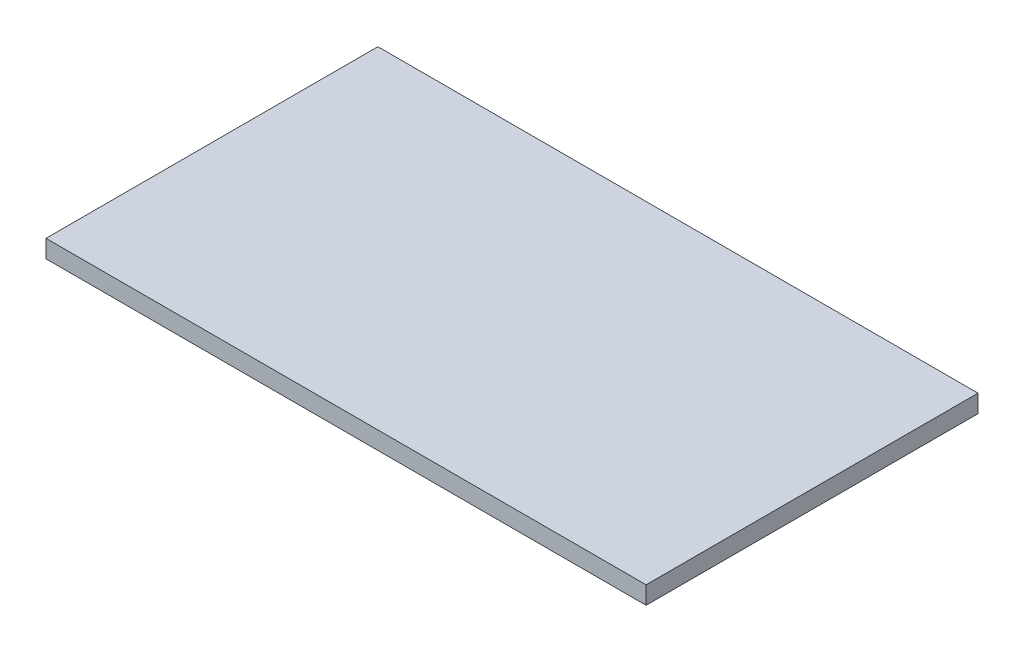
ISO-10303-21;
HEADER;
FILE_DESCRIPTION(('STEP AP214'),'2;1');
FILE_NAME('part.step','',(''),(''),'','','');
FILE_SCHEMA(('AUTOMOTIVE_DESIGN { 1 0 10303 214 1 1 1 1 }'));
ENDSEC;
DATA;
#1=APPLICATION_CONTEXT('core data for automotive mechanical design processes');
#2=APPLICATION_PROTOCOL_DEFINITION('international standard','automotive_design',2000,#1);
#3=PRODUCT_CONTEXT('',#1,'mechanical');
#4=PRODUCT('Part','Part','',(#3));
#5=PRODUCT_RELATED_PRODUCT_CATEGORY('part','',(#4));
#6=PRODUCT_DEFINITION_FORMATION('','',#4);
#7=PRODUCT_DEFINITION_CONTEXT('part definition',#1,'design');
#8=PRODUCT_DEFINITION('design','',#6,#7);
#9=PRODUCT_DEFINITION_SHAPE('','',#8);
#10=(LENGTH_UNIT() NAMED_UNIT(*) SI_UNIT(.MILLI.,.METRE.));
#11=(NAMED_UNIT(*) PLANE_ANGLE_UNIT() SI_UNIT($,.RADIAN.));
#12=(NAMED_UNIT(*) SI_UNIT($,.STERADIAN.) SOLID_ANGLE_UNIT());
#13=UNCERTAINTY_MEASURE_WITH_UNIT(LENGTH_MEASURE(1.E-05),#10,'distance_accuracy_value','');
#14=(GEOMETRIC_REPRESENTATION_CONTEXT(3) GLOBAL_UNCERTAINTY_ASSIGNED_CONTEXT((#13)) GLOBAL_UNIT_ASSIGNED_CONTEXT((#10,
#11,#12)) REPRESENTATION_CONTEXT('',''));
#15=CARTESIAN_POINT('',(0.,0.,0.));
#16=DIRECTION('',(0.,0.,1.));
#17=DIRECTION('',(1.,0.,0.));
#18=AXIS2_PLACEMENT_3D('',#15,#16,#17);
#19=CARTESIAN_POINT('',(-321.46875,19.05,-177.8));
#20=DIRECTION('',(1.,0.,0.));
#21=DIRECTION('',(0.,0.,-1.));
#22=AXIS2_PLACEMENT_3D('',#19,#20,#21);
#23=PLANE('',#22);
#24=DIRECTION('',(0.,0.,1.));
#25=VECTOR('',#24,1.);
#26=CARTESIAN_POINT('',(-321.46875,0.,-177.8));
#27=LINE('',#26,#25);
#28=CARTESIAN_POINT('',(-321.46875,0.,-177.8));
#29=VERTEX_POINT('',#28);
#30=CARTESIAN_POINT('',(-321.46875,0.,177.8));
#31=VERTEX_POINT('',#30);
#32=EDGE_CURVE('E95',#29,#31,#27,.T.);
#33=ORIENTED_EDGE('',*,*,#32,.T.);
#34=DIRECTION('',(0.,-1.,0.));
#35=VECTOR('',#34,1.);
#36=CARTESIAN_POINT('',(-321.46875,19.05,177.8));
#37=LINE('',#36,#35);
#38=CARTESIAN_POINT('',(-321.46875,19.05,177.8));
#39=VERTEX_POINT('',#38);
#40=EDGE_CURVE('E11',#39,#31,#37,.T.);
#41=ORIENTED_EDGE('',*,*,#40,.F.);
#42=DIRECTION('',(0.,0.,1.));
#43=VECTOR('',#42,1.);
#44=CARTESIAN_POINT('',(-321.46875,19.05,-177.8));
#45=LINE('',#44,#43);
#46=CARTESIAN_POINT('',(-321.46875,19.05,-177.8));
#47=VERTEX_POINT('',#46);
#48=EDGE_CURVE('E83',#47,#39,#45,.T.);
#49=ORIENTED_EDGE('',*,*,#48,.F.);
#50=DIRECTION('',(0.,-1.,0.));
#51=VECTOR('',#50,1.);
#52=CARTESIAN_POINT('',(-321.46875,19.05,-177.8));
#53=LINE('',#52,#51);
#54=EDGE_CURVE('E91',#47,#29,#53,.T.);
#55=ORIENTED_EDGE('',*,*,#54,.T.);
#56=EDGE_LOOP('',(#33,#41,#49,#55));
#57=FACE_BOUND('',#56,.T.);
#58=ADVANCED_FACE('F32',(#57),#23,.F.);
#59=CARTESIAN_POINT('',(321.46875,19.05,177.8));
#60=DIRECTION('',(0.,0.,-1.));
#61=DIRECTION('',(-1.,0.,0.));
#62=AXIS2_PLACEMENT_3D('',#59,#60,#61);
#63=PLANE('',#62);
#64=DIRECTION('',(1.,0.,0.));
#65=VECTOR('',#64,1.);
#66=CARTESIAN_POINT('',(321.46875,0.,177.8));
#67=LINE('',#66,#65);
#68=CARTESIAN_POINT('',(321.46875,0.,177.8));
#69=VERTEX_POINT('',#68);
#70=EDGE_CURVE('E87',#31,#69,#67,.T.);
#71=ORIENTED_EDGE('',*,*,#70,.T.);
#72=DIRECTION('',(0.,-1.,0.));
#73=VECTOR('',#72,1.);
#74=CARTESIAN_POINT('',(321.46875,19.05,177.8));
#75=LINE('',#74,#73);
#76=CARTESIAN_POINT('',(321.46875,19.05,177.8));
#77=VERTEX_POINT('',#76);
#78=EDGE_CURVE('E40',#77,#69,#75,.T.);
#79=ORIENTED_EDGE('',*,*,#78,.F.);
#80=DIRECTION('',(1.,0.,0.));
#81=VECTOR('',#80,1.);
#82=CARTESIAN_POINT('',(321.46875,19.05,177.8));
#83=LINE('',#82,#81);
#84=EDGE_CURVE('E78',#39,#77,#83,.T.);
#85=ORIENTED_EDGE('',*,*,#84,.F.);
#86=ORIENTED_EDGE('',*,*,#40,.T.);
#87=EDGE_LOOP('',(#71,#79,#85,#86));
#88=FACE_BOUND('',#87,.T.);
#89=ADVANCED_FACE('F86',(#88),#63,.F.);
#90=CARTESIAN_POINT('',(321.46875,19.05,-177.8));
#91=DIRECTION('',(-1.,0.,0.));
#92=DIRECTION('',(0.,0.,1.));
#93=AXIS2_PLACEMENT_3D('',#90,#91,#92);
#94=PLANE('',#93);
#95=DIRECTION('',(0.,0.,-1.));
#96=VECTOR('',#95,1.);
#97=CARTESIAN_POINT('',(321.46875,0.,-177.8));
#98=LINE('',#97,#96);
#99=CARTESIAN_POINT('',(321.46875,0.,-177.8));
#100=VERTEX_POINT('',#99);
#101=EDGE_CURVE('E65',#69,#100,#98,.T.);
#102=ORIENTED_EDGE('',*,*,#101,.T.);
#103=DIRECTION('',(0.,-1.,0.));
#104=VECTOR('',#103,1.);
#105=CARTESIAN_POINT('',(321.46875,19.05,-177.8));
#106=LINE('',#105,#104);
#107=CARTESIAN_POINT('',(321.46875,19.05,-177.8));
#108=VERTEX_POINT('',#107);
#109=EDGE_CURVE('E88',#108,#100,#106,.T.);
#110=ORIENTED_EDGE('',*,*,#109,.F.);
#111=DIRECTION('',(0.,0.,-1.));
#112=VECTOR('',#111,1.);
#113=CARTESIAN_POINT('',(321.46875,19.05,-177.8));
#114=LINE('',#113,#112);
#115=EDGE_CURVE('E81',#77,#108,#114,.T.);
#116=ORIENTED_EDGE('',*,*,#115,.F.);
#117=ORIENTED_EDGE('',*,*,#78,.T.);
#118=EDGE_LOOP('',(#102,#110,#116,#117));
#119=FACE_BOUND('',#118,.T.);
#120=ADVANCED_FACE('F89',(#119),#94,.F.);
#121=CARTESIAN_POINT('',(321.46875,19.05,-177.8));
#122=DIRECTION('',(0.,0.,1.));
#123=DIRECTION('',(1.,0.,0.));
#124=AXIS2_PLACEMENT_3D('',#121,#122,#123);
#125=PLANE('',#124);
#126=DIRECTION('',(-1.,0.,0.));
#127=VECTOR('',#126,1.);
#128=CARTESIAN_POINT('',(321.46875,0.,-177.8));
#129=LINE('',#128,#127);
#130=EDGE_CURVE('E71',#100,#29,#129,.T.);
#131=ORIENTED_EDGE('',*,*,#130,.T.);
#132=ORIENTED_EDGE('',*,*,#54,.F.);
#133=DIRECTION('',(-1.,0.,0.));
#134=VECTOR('',#133,1.);
#135=CARTESIAN_POINT('',(321.46875,19.05,-177.8));
#136=LINE('',#135,#134);
#137=EDGE_CURVE('E48',#108,#47,#136,.T.);
#138=ORIENTED_EDGE('',*,*,#137,.F.);
#139=ORIENTED_EDGE('',*,*,#109,.T.);
#140=EDGE_LOOP('',(#131,#132,#138,#139));
#141=FACE_BOUND('',#140,.T.);
#142=ADVANCED_FACE('F102',(#141),#125,.F.);
#143=CARTESIAN_POINT('',(0.,19.05,0.));
#144=DIRECTION('',(0.,-1.,0.));
#145=DIRECTION('',(0.,0.,-1.));
#146=AXIS2_PLACEMENT_3D('',#143,#144,#145);
#147=PLANE('',#146);
#148=ORIENTED_EDGE('',*,*,#48,.T.);
#149=ORIENTED_EDGE('',*,*,#84,.T.);
#150=ORIENTED_EDGE('',*,*,#115,.T.);
#151=ORIENTED_EDGE('',*,*,#137,.T.);
#152=EDGE_LOOP('',(#148,#149,#150,#151));
#153=FACE_BOUND('',#152,.T.);
#154=ADVANCED_FACE('F79',(#153),#147,.F.);
#155=CARTESIAN_POINT('',(0.,0.,0.));
#156=DIRECTION('',(0.,-1.,0.));
#157=DIRECTION('',(0.,0.,-1.));
#158=AXIS2_PLACEMENT_3D('',#155,#156,#157);
#159=PLANE('',#158);
#160=ORIENTED_EDGE('',*,*,#32,.F.);
#161=ORIENTED_EDGE('',*,*,#130,.F.);
#162=ORIENTED_EDGE('',*,*,#101,.F.);
#163=ORIENTED_EDGE('',*,*,#70,.F.);
#164=EDGE_LOOP('',(#160,#161,#162,#163));
#165=FACE_BOUND('',#164,.T.);
#166=ADVANCED_FACE('F105',(#165),#159,.T.);
#167=CLOSED_SHELL('',(#58,#89,#120,#142,#154,#166));
#168=MANIFOLD_SOLID_BREP('B2',#167);
#169=ADVANCED_BREP_SHAPE_REPRESENTATION('',(#18,#168),#14);
#170=SHAPE_DEFINITION_REPRESENTATION(#9,#169);
ENDSEC;
END-ISO-10303-21;
